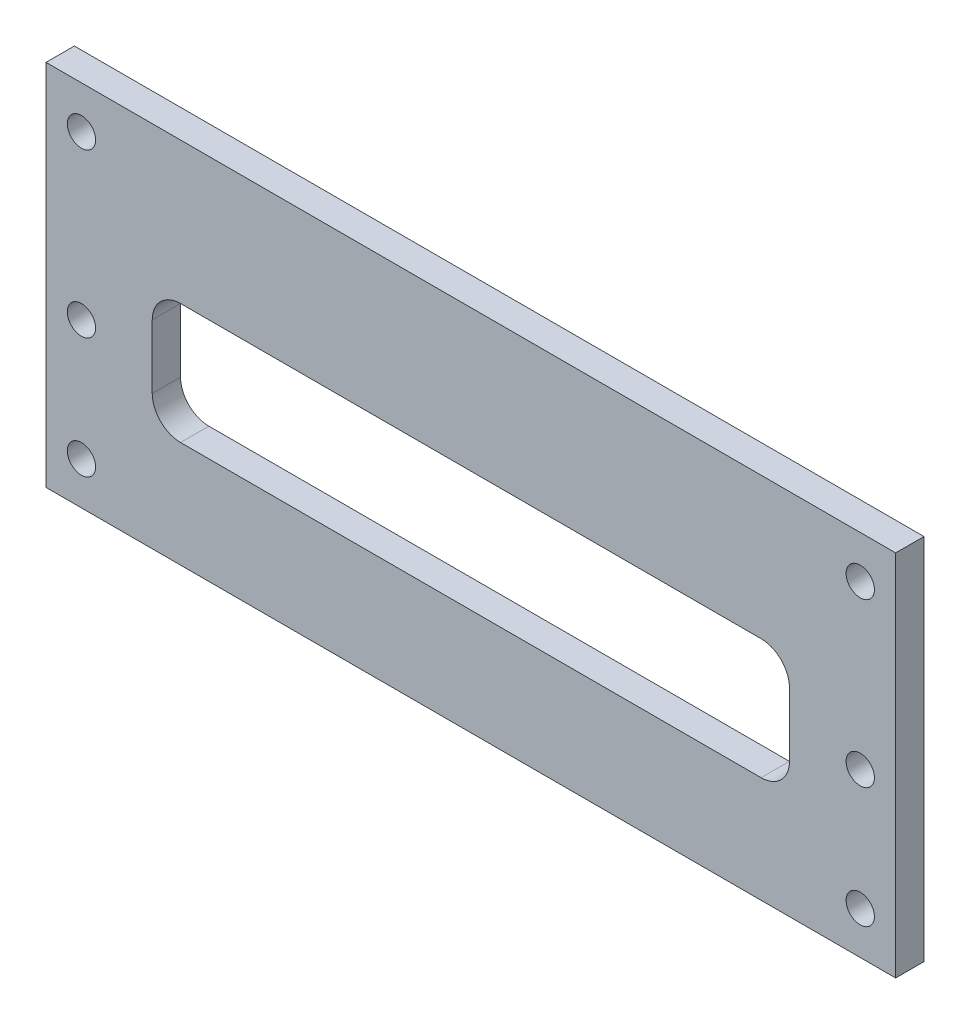
ISO-10303-21;
HEADER;
FILE_DESCRIPTION(('STEP AP214'),'2;1');
FILE_NAME('part.step','',(''),(''),'','','');
FILE_SCHEMA(('AUTOMOTIVE_DESIGN { 1 0 10303 214 1 1 1 1 }'));
ENDSEC;
DATA;
#1=APPLICATION_CONTEXT('core data for automotive mechanical design processes');
#2=APPLICATION_PROTOCOL_DEFINITION('international standard','automotive_design',2000,#1);
#3=PRODUCT_CONTEXT('',#1,'mechanical');
#4=PRODUCT('Part','Part','',(#3));
#5=PRODUCT_RELATED_PRODUCT_CATEGORY('part','',(#4));
#6=PRODUCT_DEFINITION_FORMATION('','',#4);
#7=PRODUCT_DEFINITION_CONTEXT('part definition',#1,'design');
#8=PRODUCT_DEFINITION('design','',#6,#7);
#9=PRODUCT_DEFINITION_SHAPE('','',#8);
#10=(LENGTH_UNIT() NAMED_UNIT(*) SI_UNIT(.MILLI.,.METRE.));
#11=(NAMED_UNIT(*) PLANE_ANGLE_UNIT() SI_UNIT($,.RADIAN.));
#12=(NAMED_UNIT(*) SI_UNIT($,.STERADIAN.) SOLID_ANGLE_UNIT());
#13=UNCERTAINTY_MEASURE_WITH_UNIT(LENGTH_MEASURE(1.E-05),#10,'distance_accuracy_value','');
#14=(GEOMETRIC_REPRESENTATION_CONTEXT(3) GLOBAL_UNCERTAINTY_ASSIGNED_CONTEXT((#13)) GLOBAL_UNIT_ASSIGNED_CONTEXT((#10,
#11,#12)) REPRESENTATION_CONTEXT('',''));
#15=CARTESIAN_POINT('',(0.,0.,0.));
#16=DIRECTION('',(0.,0.,1.));
#17=DIRECTION('',(1.,0.,0.));
#18=AXIS2_PLACEMENT_3D('',#15,#16,#17);
#19=CARTESIAN_POINT('',(0.,0.,20.));
#20=DIRECTION('',(0.,0.,-1.));
#21=DIRECTION('',(-1.,0.,0.));
#22=AXIS2_PLACEMENT_3D('',#19,#20,#21);
#23=PLANE('',#22);
#24=CARTESIAN_POINT('',(275.,-100.,20.));
#25=DIRECTION('',(0.,0.,1.));
#26=DIRECTION('',(1.,0.,0.));
#27=AXIS2_PLACEMENT_3D('',#24,#25,#26);
#28=CIRCLE('',#27,10.);
#29=CARTESIAN_POINT('',(285.,-100.,20.));
#30=VERTEX_POINT('',#29);
#31=EDGE_CURVE('E167',#30,#30,#28,.F.);
#32=ORIENTED_EDGE('',*,*,#31,.T.);
#33=EDGE_LOOP('',(#32));
#34=FACE_BOUND('',#33,.T.);
#35=CARTESIAN_POINT('',(275.,-15.,20.));
#36=DIRECTION('',(0.,0.,1.));
#37=DIRECTION('',(1.,0.,0.));
#38=AXIS2_PLACEMENT_3D('',#35,#36,#37);
#39=CIRCLE('',#38,10.);
#40=CARTESIAN_POINT('',(285.,-15.,20.));
#41=VERTEX_POINT('',#40);
#42=EDGE_CURVE('E170',#41,#41,#39,.F.);
#43=ORIENTED_EDGE('',*,*,#42,.T.);
#44=EDGE_LOOP('',(#43));
#45=FACE_BOUND('',#44,.T.);
#46=CARTESIAN_POINT('',(275.,100.,20.));
#47=DIRECTION('',(0.,0.,1.));
#48=DIRECTION('',(1.,0.,0.));
#49=AXIS2_PLACEMENT_3D('',#46,#47,#48);
#50=CIRCLE('',#49,10.);
#51=CARTESIAN_POINT('',(285.,100.,20.));
#52=VERTEX_POINT('',#51);
#53=EDGE_CURVE('E173',#52,#52,#50,.F.);
#54=ORIENTED_EDGE('',*,*,#53,.T.);
#55=EDGE_LOOP('',(#54));
#56=FACE_BOUND('',#55,.T.);
#57=CARTESIAN_POINT('',(-275.,-100.,20.));
#58=DIRECTION('',(0.,0.,1.));
#59=DIRECTION('',(1.,0.,0.));
#60=AXIS2_PLACEMENT_3D('',#57,#58,#59);
#61=CIRCLE('',#60,10.);
#62=CARTESIAN_POINT('',(-265.,-100.,20.));
#63=VERTEX_POINT('',#62);
#64=EDGE_CURVE('E176',#63,#63,#61,.F.);
#65=ORIENTED_EDGE('',*,*,#64,.T.);
#66=EDGE_LOOP('',(#65));
#67=FACE_BOUND('',#66,.T.);
#68=DIRECTION('',(1.,0.,0.));
#69=VECTOR('',#68,1.);
#70=CARTESIAN_POINT('',(-300.,130.,20.));
#71=LINE('',#70,#69);
#72=CARTESIAN_POINT('',(300.,130.,20.));
#73=VERTEX_POINT('',#72);
#74=CARTESIAN_POINT('',(-300.,130.,20.));
#75=VERTEX_POINT('',#74);
#76=EDGE_CURVE('E208',#73,#75,#71,.F.);
#77=ORIENTED_EDGE('',*,*,#76,.T.);
#78=DIRECTION('',(0.,1.,0.));
#79=VECTOR('',#78,1.);
#80=CARTESIAN_POINT('',(-300.,-130.,20.));
#81=LINE('',#80,#79);
#82=CARTESIAN_POINT('',(-300.,-130.,20.));
#83=VERTEX_POINT('',#82);
#84=EDGE_CURVE('E215',#75,#83,#81,.F.);
#85=ORIENTED_EDGE('',*,*,#84,.T.);
#86=DIRECTION('',(1.,0.,0.));
#87=VECTOR('',#86,1.);
#88=CARTESIAN_POINT('',(-300.,-130.,20.));
#89=LINE('',#88,#87);
#90=CARTESIAN_POINT('',(300.,-130.,20.));
#91=VERTEX_POINT('',#90);
#92=EDGE_CURVE('E219',#83,#91,#89,.T.);
#93=ORIENTED_EDGE('',*,*,#92,.T.);
#94=DIRECTION('',(0.,1.,0.));
#95=VECTOR('',#94,1.);
#96=CARTESIAN_POINT('',(300.,-130.,20.));
#97=LINE('',#96,#95);
#98=EDGE_CURVE('E182',#91,#73,#97,.T.);
#99=ORIENTED_EDGE('',*,*,#98,.T.);
#100=EDGE_LOOP('',(#77,#85,#93,#99));
#101=FACE_BOUND('',#100,.T.);
#102=CARTESIAN_POINT('',(-275.,100.,20.));
#103=DIRECTION('',(0.,0.,1.));
#104=DIRECTION('',(1.,0.,0.));
#105=AXIS2_PLACEMENT_3D('',#102,#103,#104);
#106=CIRCLE('',#105,10.);
#107=CARTESIAN_POINT('',(-265.,100.,20.));
#108=VERTEX_POINT('',#107);
#109=EDGE_CURVE('E179',#108,#108,#106,.F.);
#110=ORIENTED_EDGE('',*,*,#109,.T.);
#111=EDGE_LOOP('',(#110));
#112=FACE_BOUND('',#111,.T.);
#113=CARTESIAN_POINT('',(-275.,-15.,20.));
#114=DIRECTION('',(0.,0.,1.));
#115=DIRECTION('',(1.,0.,0.));
#116=AXIS2_PLACEMENT_3D('',#113,#114,#115);
#117=CIRCLE('',#116,10.);
#118=CARTESIAN_POINT('',(-265.,-15.,20.));
#119=VERTEX_POINT('',#118);
#120=EDGE_CURVE('E183',#119,#119,#117,.F.);
#121=ORIENTED_EDGE('',*,*,#120,.T.);
#122=EDGE_LOOP('',(#121));
#123=FACE_BOUND('',#122,.T.);
#124=CARTESIAN_POINT('',(205.,10.,20.));
#125=DIRECTION('',(0.,0.,-1.));
#126=DIRECTION('',(-1.,0.,0.));
#127=AXIS2_PLACEMENT_3D('',#124,#125,#126);
#128=CIRCLE('',#127,20.);
#129=CARTESIAN_POINT('',(205.,30.,20.));
#130=VERTEX_POINT('',#129);
#131=CARTESIAN_POINT('',(225.,10.,20.));
#132=VERTEX_POINT('',#131);
#133=EDGE_CURVE('E191',#130,#132,#128,.T.);
#134=ORIENTED_EDGE('',*,*,#133,.T.);
#135=DIRECTION('',(0.,1.,0.));
#136=VECTOR('',#135,1.);
#137=CARTESIAN_POINT('',(225.,-55.,20.));
#138=LINE('',#137,#136);
#139=CARTESIAN_POINT('',(225.,-35.,20.));
#140=VERTEX_POINT('',#139);
#141=EDGE_CURVE('E103',#132,#140,#138,.F.);
#142=ORIENTED_EDGE('',*,*,#141,.T.);
#143=CARTESIAN_POINT('',(205.,-35.,20.));
#144=DIRECTION('',(0.,0.,-1.));
#145=DIRECTION('',(-1.,0.,0.));
#146=AXIS2_PLACEMENT_3D('',#143,#144,#145);
#147=CIRCLE('',#146,20.);
#148=CARTESIAN_POINT('',(205.,-55.,20.));
#149=VERTEX_POINT('',#148);
#150=EDGE_CURVE('E19',#140,#149,#147,.T.);
#151=ORIENTED_EDGE('',*,*,#150,.T.);
#152=DIRECTION('',(1.,0.,0.));
#153=VECTOR('',#152,1.);
#154=CARTESIAN_POINT('',(-225.,-55.,20.));
#155=LINE('',#154,#153);
#156=CARTESIAN_POINT('',(-205.,-55.,20.));
#157=VERTEX_POINT('',#156);
#158=EDGE_CURVE('E106',#149,#157,#155,.F.);
#159=ORIENTED_EDGE('',*,*,#158,.T.);
#160=CARTESIAN_POINT('',(-205.,-35.,20.));
#161=DIRECTION('',(0.,0.,-1.));
#162=DIRECTION('',(-1.,0.,0.));
#163=AXIS2_PLACEMENT_3D('',#160,#161,#162);
#164=CIRCLE('',#163,20.);
#165=CARTESIAN_POINT('',(-225.,-35.,20.));
#166=VERTEX_POINT('',#165);
#167=EDGE_CURVE('E187',#157,#166,#164,.T.);
#168=ORIENTED_EDGE('',*,*,#167,.T.);
#169=DIRECTION('',(0.,1.,0.));
#170=VECTOR('',#169,1.);
#171=CARTESIAN_POINT('',(-225.,-55.,20.));
#172=LINE('',#171,#170);
#173=CARTESIAN_POINT('',(-225.,10.,20.));
#174=VERTEX_POINT('',#173);
#175=EDGE_CURVE('E129',#166,#174,#172,.T.);
#176=ORIENTED_EDGE('',*,*,#175,.T.);
#177=CARTESIAN_POINT('',(-205.,10.,20.));
#178=DIRECTION('',(0.,0.,-1.));
#179=DIRECTION('',(-1.,0.,0.));
#180=AXIS2_PLACEMENT_3D('',#177,#178,#179);
#181=CIRCLE('',#180,20.);
#182=CARTESIAN_POINT('',(-205.,30.,20.));
#183=VERTEX_POINT('',#182);
#184=EDGE_CURVE('E189',#174,#183,#181,.T.);
#185=ORIENTED_EDGE('',*,*,#184,.T.);
#186=DIRECTION('',(1.,0.,0.));
#187=VECTOR('',#186,1.);
#188=CARTESIAN_POINT('',(-225.,30.,20.));
#189=LINE('',#188,#187);
#190=EDGE_CURVE('E133',#183,#130,#189,.T.);
#191=ORIENTED_EDGE('',*,*,#190,.T.);
#192=EDGE_LOOP('',(#134,#142,#151,#159,#168,#176,#185,#191));
#193=FACE_BOUND('',#192,.T.);
#194=ADVANCED_FACE('F16',(#34,#45,#56,#67,#101,#112,#123,#193),#23,.F.);
#195=CARTESIAN_POINT('',(-225.,-55.,0.));
#196=DIRECTION('',(0.,-1.,0.));
#197=DIRECTION('',(0.,0.,-1.));
#198=AXIS2_PLACEMENT_3D('',#195,#196,#197);
#199=PLANE('',#198);
#200=DIRECTION('',(0.,0.,-1.));
#201=VECTOR('',#200,1.);
#202=CARTESIAN_POINT('',(205.,-55.,0.));
#203=LINE('',#202,#201);
#204=CARTESIAN_POINT('',(205.,-55.,0.));
#205=VERTEX_POINT('',#204);
#206=EDGE_CURVE('E111',#149,#205,#203,.T.);
#207=ORIENTED_EDGE('',*,*,#206,.T.);
#208=DIRECTION('',(-1.,0.,0.));
#209=VECTOR('',#208,1.);
#210=CARTESIAN_POINT('',(0.,-55.,0.));
#211=LINE('',#210,#209);
#212=CARTESIAN_POINT('',(-205.,-55.,0.));
#213=VERTEX_POINT('',#212);
#214=EDGE_CURVE('E166',#213,#205,#211,.F.);
#215=ORIENTED_EDGE('',*,*,#214,.F.);
#216=DIRECTION('',(0.,0.,-1.));
#217=VECTOR('',#216,1.);
#218=CARTESIAN_POINT('',(-205.,-55.,0.));
#219=LINE('',#218,#217);
#220=EDGE_CURVE('E116',#213,#157,#219,.F.);
#221=ORIENTED_EDGE('',*,*,#220,.T.);
#222=ORIENTED_EDGE('',*,*,#158,.F.);
#223=EDGE_LOOP('',(#207,#215,#221,#222));
#224=FACE_BOUND('',#223,.T.);
#225=ADVANCED_FACE('F113',(#224),#199,.F.);
#226=CARTESIAN_POINT('',(205.,-35.,0.));
#227=DIRECTION('',(0.,0.,-1.));
#228=DIRECTION('',(-1.,0.,0.));
#229=AXIS2_PLACEMENT_3D('',#226,#227,#228);
#230=CYLINDRICAL_SURFACE('',#229,20.);
#231=ORIENTED_EDGE('',*,*,#206,.F.);
#232=ORIENTED_EDGE('',*,*,#150,.F.);
#233=DIRECTION('',(0.,0.,-1.));
#234=VECTOR('',#233,1.);
#235=CARTESIAN_POINT('',(225.,-35.,0.));
#236=LINE('',#235,#234);
#237=CARTESIAN_POINT('',(225.,-35.,0.));
#238=VERTEX_POINT('',#237);
#239=EDGE_CURVE('E124',#140,#238,#236,.T.);
#240=ORIENTED_EDGE('',*,*,#239,.T.);
#241=CARTESIAN_POINT('',(205.,-35.,0.));
#242=DIRECTION('',(0.,0.,-1.));
#243=DIRECTION('',(-1.,0.,0.));
#244=AXIS2_PLACEMENT_3D('',#241,#242,#243);
#245=CIRCLE('',#244,20.);
#246=EDGE_CURVE('E121',#205,#238,#245,.F.);
#247=ORIENTED_EDGE('',*,*,#246,.F.);
#248=EDGE_LOOP('',(#231,#232,#240,#247));
#249=FACE_BOUND('',#248,.T.);
#250=ADVANCED_FACE('F119',(#249),#230,.F.);
#251=CARTESIAN_POINT('',(225.,-55.,0.));
#252=DIRECTION('',(1.,0.,0.));
#253=DIRECTION('',(0.,0.,-1.));
#254=AXIS2_PLACEMENT_3D('',#251,#252,#253);
#255=PLANE('',#254);
#256=ORIENTED_EDGE('',*,*,#239,.F.);
#257=ORIENTED_EDGE('',*,*,#141,.F.);
#258=DIRECTION('',(0.,0.,-1.));
#259=VECTOR('',#258,1.);
#260=CARTESIAN_POINT('',(225.,10.,0.));
#261=LINE('',#260,#259);
#262=CARTESIAN_POINT('',(225.,10.,0.));
#263=VERTEX_POINT('',#262);
#264=EDGE_CURVE('E135',#132,#263,#261,.T.);
#265=ORIENTED_EDGE('',*,*,#264,.T.);
#266=DIRECTION('',(0.,1.,0.));
#267=VECTOR('',#266,1.);
#268=CARTESIAN_POINT('',(225.,0.,0.));
#269=LINE('',#268,#267);
#270=EDGE_CURVE('E164',#238,#263,#269,.T.);
#271=ORIENTED_EDGE('',*,*,#270,.F.);
#272=EDGE_LOOP('',(#256,#257,#265,#271));
#273=FACE_BOUND('',#272,.T.);
#274=ADVANCED_FACE('F196',(#273),#255,.F.);
#275=CARTESIAN_POINT('',(205.,10.,0.));
#276=DIRECTION('',(0.,0.,-1.));
#277=DIRECTION('',(-1.,0.,0.));
#278=AXIS2_PLACEMENT_3D('',#275,#276,#277);
#279=CYLINDRICAL_SURFACE('',#278,20.);
#280=ORIENTED_EDGE('',*,*,#264,.F.);
#281=ORIENTED_EDGE('',*,*,#133,.F.);
#282=DIRECTION('',(0.,0.,1.));
#283=VECTOR('',#282,1.);
#284=CARTESIAN_POINT('',(205.,30.,0.));
#285=LINE('',#284,#283);
#286=CARTESIAN_POINT('',(205.,30.,0.));
#287=VERTEX_POINT('',#286);
#288=EDGE_CURVE('E134',#130,#287,#285,.F.);
#289=ORIENTED_EDGE('',*,*,#288,.T.);
#290=CARTESIAN_POINT('',(205.,10.,0.));
#291=DIRECTION('',(0.,0.,-1.));
#292=DIRECTION('',(-1.,0.,0.));
#293=AXIS2_PLACEMENT_3D('',#290,#291,#292);
#294=CIRCLE('',#293,20.);
#295=EDGE_CURVE('E161',#263,#287,#294,.F.);
#296=ORIENTED_EDGE('',*,*,#295,.F.);
#297=EDGE_LOOP('',(#280,#281,#289,#296));
#298=FACE_BOUND('',#297,.T.);
#299=ADVANCED_FACE('F229',(#298),#279,.F.);
#300=CARTESIAN_POINT('',(-225.,30.,0.));
#301=DIRECTION('',(0.,1.,0.));
#302=DIRECTION('',(0.,0.,1.));
#303=AXIS2_PLACEMENT_3D('',#300,#301,#302);
#304=PLANE('',#303);
#305=ORIENTED_EDGE('',*,*,#288,.F.);
#306=ORIENTED_EDGE('',*,*,#190,.F.);
#307=DIRECTION('',(0.,0.,-1.));
#308=VECTOR('',#307,1.);
#309=CARTESIAN_POINT('',(-205.,30.,0.));
#310=LINE('',#309,#308);
#311=CARTESIAN_POINT('',(-205.,30.,0.));
#312=VERTEX_POINT('',#311);
#313=EDGE_CURVE('E190',#183,#312,#310,.T.);
#314=ORIENTED_EDGE('',*,*,#313,.T.);
#315=DIRECTION('',(-1.,0.,0.));
#316=VECTOR('',#315,1.);
#317=CARTESIAN_POINT('',(0.,30.,0.));
#318=LINE('',#317,#316);
#319=EDGE_CURVE('E160',#287,#312,#318,.T.);
#320=ORIENTED_EDGE('',*,*,#319,.F.);
#321=EDGE_LOOP('',(#305,#306,#314,#320));
#322=FACE_BOUND('',#321,.T.);
#323=ADVANCED_FACE('F233',(#322),#304,.F.);
#324=CARTESIAN_POINT('',(-205.,10.,0.));
#325=DIRECTION('',(0.,0.,-1.));
#326=DIRECTION('',(-1.,0.,0.));
#327=AXIS2_PLACEMENT_3D('',#324,#325,#326);
#328=CYLINDRICAL_SURFACE('',#327,20.);
#329=ORIENTED_EDGE('',*,*,#313,.F.);
#330=ORIENTED_EDGE('',*,*,#184,.F.);
#331=DIRECTION('',(0.,0.,1.));
#332=VECTOR('',#331,1.);
#333=CARTESIAN_POINT('',(-225.,10.,0.));
#334=LINE('',#333,#332);
#335=CARTESIAN_POINT('',(-225.,10.,0.));
#336=VERTEX_POINT('',#335);
#337=EDGE_CURVE('E131',#174,#336,#334,.F.);
#338=ORIENTED_EDGE('',*,*,#337,.T.);
#339=CARTESIAN_POINT('',(-205.,10.,0.));
#340=DIRECTION('',(0.,0.,-1.));
#341=DIRECTION('',(-1.,0.,0.));
#342=AXIS2_PLACEMENT_3D('',#339,#340,#341);
#343=CIRCLE('',#342,20.);
#344=EDGE_CURVE('E157',#312,#336,#343,.F.);
#345=ORIENTED_EDGE('',*,*,#344,.F.);
#346=EDGE_LOOP('',(#329,#330,#338,#345));
#347=FACE_BOUND('',#346,.T.);
#348=ADVANCED_FACE('F334',(#347),#328,.F.);
#349=CARTESIAN_POINT('',(-225.,-55.,0.));
#350=DIRECTION('',(-1.,0.,0.));
#351=DIRECTION('',(0.,0.,1.));
#352=AXIS2_PLACEMENT_3D('',#349,#350,#351);
#353=PLANE('',#352);
#354=DIRECTION('',(0.,0.,-1.));
#355=VECTOR('',#354,1.);
#356=CARTESIAN_POINT('',(-225.,-35.,0.));
#357=LINE('',#356,#355);
#358=CARTESIAN_POINT('',(-225.,-35.,0.));
#359=VERTEX_POINT('',#358);
#360=EDGE_CURVE('E186',#166,#359,#357,.T.);
#361=ORIENTED_EDGE('',*,*,#360,.T.);
#362=DIRECTION('',(0.,1.,0.));
#363=VECTOR('',#362,1.);
#364=CARTESIAN_POINT('',(-225.,0.,0.));
#365=LINE('',#364,#363);
#366=EDGE_CURVE('E156',#336,#359,#365,.F.);
#367=ORIENTED_EDGE('',*,*,#366,.F.);
#368=ORIENTED_EDGE('',*,*,#337,.F.);
#369=ORIENTED_EDGE('',*,*,#175,.F.);
#370=EDGE_LOOP('',(#361,#367,#368,#369));
#371=FACE_BOUND('',#370,.T.);
#372=ADVANCED_FACE('F327',(#371),#353,.F.);
#373=CARTESIAN_POINT('',(-205.,-35.,0.));
#374=DIRECTION('',(0.,0.,-1.));
#375=DIRECTION('',(-1.,0.,0.));
#376=AXIS2_PLACEMENT_3D('',#373,#374,#375);
#377=CYLINDRICAL_SURFACE('',#376,20.);
#378=ORIENTED_EDGE('',*,*,#360,.F.);
#379=ORIENTED_EDGE('',*,*,#167,.F.);
#380=ORIENTED_EDGE('',*,*,#220,.F.);
#381=CARTESIAN_POINT('',(-205.,-35.,0.));
#382=DIRECTION('',(0.,0.,-1.));
#383=DIRECTION('',(-1.,0.,0.));
#384=AXIS2_PLACEMENT_3D('',#381,#382,#383);
#385=CIRCLE('',#384,20.);
#386=EDGE_CURVE('E153',#359,#213,#385,.F.);
#387=ORIENTED_EDGE('',*,*,#386,.F.);
#388=EDGE_LOOP('',(#378,#379,#380,#387));
#389=FACE_BOUND('',#388,.T.);
#390=ADVANCED_FACE('F316',(#389),#377,.F.);
#391=CARTESIAN_POINT('',(-275.,-15.,20.));
#392=DIRECTION('',(0.,0.,1.));
#393=DIRECTION('',(1.,0.,0.));
#394=AXIS2_PLACEMENT_3D('',#391,#392,#393);
#395=CYLINDRICAL_SURFACE('',#394,10.);
#396=ORIENTED_EDGE('',*,*,#120,.F.);
#397=EDGE_LOOP('',(#396));
#398=FACE_BOUND('',#397,.T.);
#399=CARTESIAN_POINT('',(-275.,-15.,0.));
#400=DIRECTION('',(0.,0.,1.));
#401=DIRECTION('',(1.,0.,0.));
#402=AXIS2_PLACEMENT_3D('',#399,#400,#401);
#403=CIRCLE('',#402,10.);
#404=CARTESIAN_POINT('',(-265.,-15.,0.));
#405=VERTEX_POINT('',#404);
#406=EDGE_CURVE('E150',#405,#405,#403,.T.);
#407=ORIENTED_EDGE('',*,*,#406,.F.);
#408=EDGE_LOOP('',(#407));
#409=FACE_BOUND('',#408,.T.);
#410=ADVANCED_FACE('F312',(#398,#409),#395,.F.);
#411=CARTESIAN_POINT('',(-275.,100.,20.));
#412=DIRECTION('',(0.,0.,1.));
#413=DIRECTION('',(1.,0.,0.));
#414=AXIS2_PLACEMENT_3D('',#411,#412,#413);
#415=CYLINDRICAL_SURFACE('',#414,10.);
#416=ORIENTED_EDGE('',*,*,#109,.F.);
#417=EDGE_LOOP('',(#416));
#418=FACE_BOUND('',#417,.T.);
#419=CARTESIAN_POINT('',(-275.,100.,0.));
#420=DIRECTION('',(0.,0.,1.));
#421=DIRECTION('',(1.,0.,0.));
#422=AXIS2_PLACEMENT_3D('',#419,#420,#421);
#423=CIRCLE('',#422,10.);
#424=CARTESIAN_POINT('',(-265.,100.,0.));
#425=VERTEX_POINT('',#424);
#426=EDGE_CURVE('E146',#425,#425,#423,.T.);
#427=ORIENTED_EDGE('',*,*,#426,.F.);
#428=EDGE_LOOP('',(#427));
#429=FACE_BOUND('',#428,.T.);
#430=ADVANCED_FACE('F315',(#418,#429),#415,.F.);
#431=CARTESIAN_POINT('',(300.,-130.,20.));
#432=DIRECTION('',(-1.,0.,0.));
#433=DIRECTION('',(0.,0.,1.));
#434=AXIS2_PLACEMENT_3D('',#431,#432,#433);
#435=PLANE('',#434);
#436=DIRECTION('',(0.,0.,-1.));
#437=VECTOR('',#436,1.);
#438=CARTESIAN_POINT('',(300.,130.,20.));
#439=LINE('',#438,#437);
#440=CARTESIAN_POINT('',(300.,130.,0.));
#441=VERTEX_POINT('',#440);
#442=EDGE_CURVE('E210',#441,#73,#439,.F.);
#443=ORIENTED_EDGE('',*,*,#442,.T.);
#444=ORIENTED_EDGE('',*,*,#98,.F.);
#445=DIRECTION('',(0.,0.,1.));
#446=VECTOR('',#445,1.);
#447=CARTESIAN_POINT('',(300.,-130.,20.));
#448=LINE('',#447,#446);
#449=CARTESIAN_POINT('',(300.,-130.,0.));
#450=VERTEX_POINT('',#449);
#451=EDGE_CURVE('E217',#91,#450,#448,.F.);
#452=ORIENTED_EDGE('',*,*,#451,.T.);
#453=DIRECTION('',(0.,1.,0.));
#454=VECTOR('',#453,1.);
#455=CARTESIAN_POINT('',(300.,0.,0.));
#456=LINE('',#455,#454);
#457=EDGE_CURVE('E149',#441,#450,#456,.F.);
#458=ORIENTED_EDGE('',*,*,#457,.F.);
#459=EDGE_LOOP('',(#443,#444,#452,#458));
#460=FACE_BOUND('',#459,.T.);
#461=ADVANCED_FACE('F255',(#460),#435,.F.);
#462=CARTESIAN_POINT('',(-300.,-130.,20.));
#463=DIRECTION('',(0.,1.,0.));
#464=DIRECTION('',(0.,0.,1.));
#465=AXIS2_PLACEMENT_3D('',#462,#463,#464);
#466=PLANE('',#465);
#467=ORIENTED_EDGE('',*,*,#451,.F.);
#468=ORIENTED_EDGE('',*,*,#92,.F.);
#469=DIRECTION('',(0.,0.,-1.));
#470=VECTOR('',#469,1.);
#471=CARTESIAN_POINT('',(-300.,-130.,20.));
#472=LINE('',#471,#470);
#473=CARTESIAN_POINT('',(-300.,-130.,0.));
#474=VERTEX_POINT('',#473);
#475=EDGE_CURVE('E213',#83,#474,#472,.T.);
#476=ORIENTED_EDGE('',*,*,#475,.T.);
#477=DIRECTION('',(-1.,0.,0.));
#478=VECTOR('',#477,1.);
#479=CARTESIAN_POINT('',(0.,-130.,0.));
#480=LINE('',#479,#478);
#481=EDGE_CURVE('E240',#450,#474,#480,.T.);
#482=ORIENTED_EDGE('',*,*,#481,.F.);
#483=EDGE_LOOP('',(#467,#468,#476,#482));
#484=FACE_BOUND('',#483,.T.);
#485=ADVANCED_FACE('F260',(#484),#466,.F.);
#486=CARTESIAN_POINT('',(-300.,-130.,20.));
#487=DIRECTION('',(1.,0.,0.));
#488=DIRECTION('',(0.,0.,-1.));
#489=AXIS2_PLACEMENT_3D('',#486,#487,#488);
#490=PLANE('',#489);
#491=ORIENTED_EDGE('',*,*,#475,.F.);
#492=ORIENTED_EDGE('',*,*,#84,.F.);
#493=DIRECTION('',(0.,0.,-1.));
#494=VECTOR('',#493,1.);
#495=CARTESIAN_POINT('',(-300.,130.,20.));
#496=LINE('',#495,#494);
#497=CARTESIAN_POINT('',(-300.,130.,0.));
#498=VERTEX_POINT('',#497);
#499=EDGE_CURVE('E34',#75,#498,#496,.T.);
#500=ORIENTED_EDGE('',*,*,#499,.T.);
#501=DIRECTION('',(0.,1.,0.));
#502=VECTOR('',#501,1.);
#503=CARTESIAN_POINT('',(-300.,0.,0.));
#504=LINE('',#503,#502);
#505=EDGE_CURVE('E243',#474,#498,#504,.T.);
#506=ORIENTED_EDGE('',*,*,#505,.F.);
#507=EDGE_LOOP('',(#491,#492,#500,#506));
#508=FACE_BOUND('',#507,.T.);
#509=ADVANCED_FACE('F262',(#508),#490,.F.);
#510=CARTESIAN_POINT('',(-300.,130.,20.));
#511=DIRECTION('',(0.,-1.,0.));
#512=DIRECTION('',(0.,0.,-1.));
#513=AXIS2_PLACEMENT_3D('',#510,#511,#512);
#514=PLANE('',#513);
#515=ORIENTED_EDGE('',*,*,#499,.F.);
#516=ORIENTED_EDGE('',*,*,#76,.F.);
#517=ORIENTED_EDGE('',*,*,#442,.F.);
#518=DIRECTION('',(-1.,0.,0.));
#519=VECTOR('',#518,1.);
#520=CARTESIAN_POINT('',(0.,130.,0.));
#521=LINE('',#520,#519);
#522=EDGE_CURVE('E145',#498,#441,#521,.F.);
#523=ORIENTED_EDGE('',*,*,#522,.F.);
#524=EDGE_LOOP('',(#515,#516,#517,#523));
#525=FACE_BOUND('',#524,.T.);
#526=ADVANCED_FACE('F251',(#525),#514,.F.);
#527=CARTESIAN_POINT('',(-275.,-100.,20.));
#528=DIRECTION('',(0.,0.,1.));
#529=DIRECTION('',(1.,0.,0.));
#530=AXIS2_PLACEMENT_3D('',#527,#528,#529);
#531=CYLINDRICAL_SURFACE('',#530,10.);
#532=ORIENTED_EDGE('',*,*,#64,.F.);
#533=EDGE_LOOP('',(#532));
#534=FACE_BOUND('',#533,.T.);
#535=CARTESIAN_POINT('',(-275.,-100.,0.));
#536=DIRECTION('',(0.,0.,1.));
#537=DIRECTION('',(1.,0.,0.));
#538=AXIS2_PLACEMENT_3D('',#535,#536,#537);
#539=CIRCLE('',#538,10.);
#540=CARTESIAN_POINT('',(-265.,-100.,0.));
#541=VERTEX_POINT('',#540);
#542=EDGE_CURVE('E142',#541,#541,#539,.T.);
#543=ORIENTED_EDGE('',*,*,#542,.F.);
#544=EDGE_LOOP('',(#543));
#545=FACE_BOUND('',#544,.T.);
#546=ADVANCED_FACE('F271',(#534,#545),#531,.F.);
#547=CARTESIAN_POINT('',(275.,100.,20.));
#548=DIRECTION('',(0.,0.,1.));
#549=DIRECTION('',(1.,0.,0.));
#550=AXIS2_PLACEMENT_3D('',#547,#548,#549);
#551=CYLINDRICAL_SURFACE('',#550,10.);
#552=ORIENTED_EDGE('',*,*,#53,.F.);
#553=EDGE_LOOP('',(#552));
#554=FACE_BOUND('',#553,.T.);
#555=CARTESIAN_POINT('',(275.,100.,0.));
#556=DIRECTION('',(0.,0.,1.));
#557=DIRECTION('',(1.,0.,0.));
#558=AXIS2_PLACEMENT_3D('',#555,#556,#557);
#559=CIRCLE('',#558,10.);
#560=CARTESIAN_POINT('',(285.,100.,0.));
#561=VERTEX_POINT('',#560);
#562=EDGE_CURVE('E139',#561,#561,#559,.T.);
#563=ORIENTED_EDGE('',*,*,#562,.F.);
#564=EDGE_LOOP('',(#563));
#565=FACE_BOUND('',#564,.T.);
#566=ADVANCED_FACE('F289',(#554,#565),#551,.F.);
#567=CARTESIAN_POINT('',(275.,-15.,20.));
#568=DIRECTION('',(0.,0.,1.));
#569=DIRECTION('',(1.,0.,0.));
#570=AXIS2_PLACEMENT_3D('',#567,#568,#569);
#571=CYLINDRICAL_SURFACE('',#570,10.);
#572=ORIENTED_EDGE('',*,*,#42,.F.);
#573=EDGE_LOOP('',(#572));
#574=FACE_BOUND('',#573,.T.);
#575=CARTESIAN_POINT('',(275.,-15.,0.));
#576=DIRECTION('',(0.,0.,1.));
#577=DIRECTION('',(1.,0.,0.));
#578=AXIS2_PLACEMENT_3D('',#575,#576,#577);
#579=CIRCLE('',#578,10.);
#580=CARTESIAN_POINT('',(285.,-15.,0.));
#581=VERTEX_POINT('',#580);
#582=EDGE_CURVE('E25',#581,#581,#579,.T.);
#583=ORIENTED_EDGE('',*,*,#582,.F.);
#584=EDGE_LOOP('',(#583));
#585=FACE_BOUND('',#584,.T.);
#586=ADVANCED_FACE('F282',(#574,#585),#571,.F.);
#587=CARTESIAN_POINT('',(275.,-100.,20.));
#588=DIRECTION('',(0.,0.,1.));
#589=DIRECTION('',(1.,0.,0.));
#590=AXIS2_PLACEMENT_3D('',#587,#588,#589);
#591=CYLINDRICAL_SURFACE('',#590,10.);
#592=ORIENTED_EDGE('',*,*,#31,.F.);
#593=EDGE_LOOP('',(#592));
#594=FACE_BOUND('',#593,.T.);
#595=CARTESIAN_POINT('',(275.,-100.,0.));
#596=DIRECTION('',(0.,0.,1.));
#597=DIRECTION('',(1.,0.,0.));
#598=AXIS2_PLACEMENT_3D('',#595,#596,#597);
#599=CIRCLE('',#598,10.);
#600=CARTESIAN_POINT('',(285.,-100.,0.));
#601=VERTEX_POINT('',#600);
#602=EDGE_CURVE('E11',#601,#601,#599,.T.);
#603=ORIENTED_EDGE('',*,*,#602,.F.);
#604=EDGE_LOOP('',(#603));
#605=FACE_BOUND('',#604,.T.);
#606=ADVANCED_FACE('F275',(#594,#605),#591,.F.);
#607=CARTESIAN_POINT('',(0.,0.,0.));
#608=DIRECTION('',(0.,0.,-1.));
#609=DIRECTION('',(-1.,0.,0.));
#610=AXIS2_PLACEMENT_3D('',#607,#608,#609);
#611=PLANE('',#610);
#612=ORIENTED_EDGE('',*,*,#602,.T.);
#613=EDGE_LOOP('',(#612));
#614=FACE_BOUND('',#613,.T.);
#615=ORIENTED_EDGE('',*,*,#582,.T.);
#616=EDGE_LOOP('',(#615));
#617=FACE_BOUND('',#616,.T.);
#618=ORIENTED_EDGE('',*,*,#562,.T.);
#619=EDGE_LOOP('',(#618));
#620=FACE_BOUND('',#619,.T.);
#621=ORIENTED_EDGE('',*,*,#542,.T.);
#622=EDGE_LOOP('',(#621));
#623=FACE_BOUND('',#622,.T.);
#624=ORIENTED_EDGE('',*,*,#505,.T.);
#625=ORIENTED_EDGE('',*,*,#522,.T.);
#626=ORIENTED_EDGE('',*,*,#457,.T.);
#627=ORIENTED_EDGE('',*,*,#481,.T.);
#628=EDGE_LOOP('',(#624,#625,#626,#627));
#629=FACE_BOUND('',#628,.T.);
#630=ORIENTED_EDGE('',*,*,#426,.T.);
#631=EDGE_LOOP('',(#630));
#632=FACE_BOUND('',#631,.T.);
#633=ORIENTED_EDGE('',*,*,#406,.T.);
#634=EDGE_LOOP('',(#633));
#635=FACE_BOUND('',#634,.T.);
#636=ORIENTED_EDGE('',*,*,#366,.T.);
#637=ORIENTED_EDGE('',*,*,#386,.T.);
#638=ORIENTED_EDGE('',*,*,#214,.T.);
#639=ORIENTED_EDGE('',*,*,#246,.T.);
#640=ORIENTED_EDGE('',*,*,#270,.T.);
#641=ORIENTED_EDGE('',*,*,#295,.T.);
#642=ORIENTED_EDGE('',*,*,#319,.T.);
#643=ORIENTED_EDGE('',*,*,#344,.T.);
#644=EDGE_LOOP('',(#636,#637,#638,#639,#640,#641,#642,#643));
#645=FACE_BOUND('',#644,.T.);
#646=ADVANCED_FACE('F202',(#614,#617,#620,#623,#629,#632,#635,#645),#611,.T.);
#647=CLOSED_SHELL('',(#194,#225,#250,#274,#299,#323,#348,#372,#390,#410,#430,#461,#485,#509,
#526,#546,#566,#586,#606,#646));
#648=MANIFOLD_SOLID_BREP('B1',#647);
#649=ADVANCED_BREP_SHAPE_REPRESENTATION('',(#18,#648),#14);
#650=SHAPE_DEFINITION_REPRESENTATION(#9,#649);
ENDSEC;
END-ISO-10303-21;
